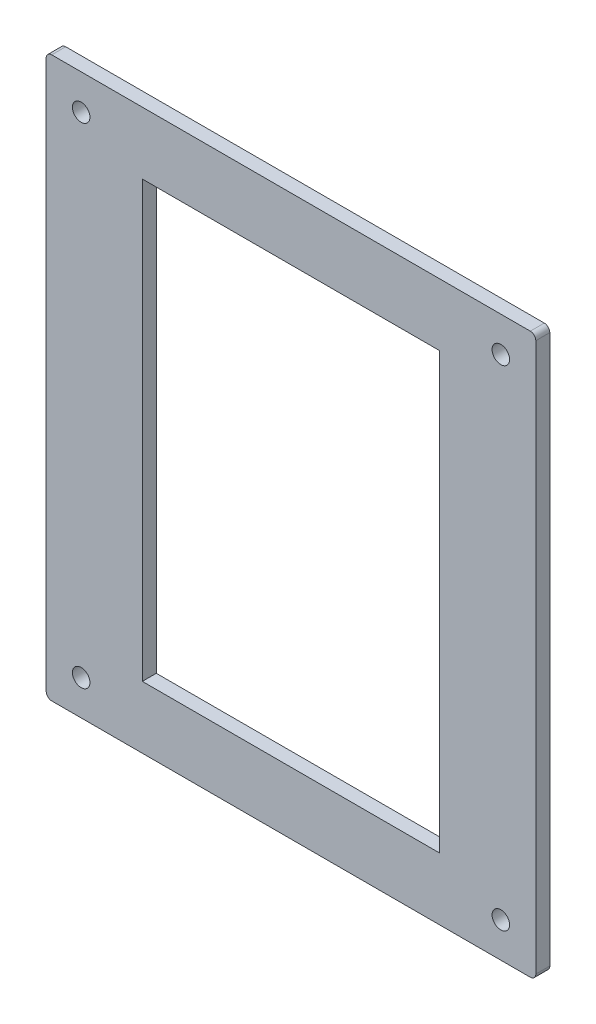
ISO-10303-21;
HEADER;
FILE_DESCRIPTION(('STEP AP214'),'2;1');
FILE_NAME('part.step','',(''),(''),'','','');
FILE_SCHEMA(('AUTOMOTIVE_DESIGN { 1 0 10303 214 1 1 1 1 }'));
ENDSEC;
DATA;
#1=APPLICATION_CONTEXT('core data for automotive mechanical design processes');
#2=APPLICATION_PROTOCOL_DEFINITION('international standard','automotive_design',2000,#1);
#3=PRODUCT_CONTEXT('',#1,'mechanical');
#4=PRODUCT('Part','Part','',(#3));
#5=PRODUCT_RELATED_PRODUCT_CATEGORY('part','',(#4));
#6=PRODUCT_DEFINITION_FORMATION('','',#4);
#7=PRODUCT_DEFINITION_CONTEXT('part definition',#1,'design');
#8=PRODUCT_DEFINITION('design','',#6,#7);
#9=PRODUCT_DEFINITION_SHAPE('','',#8);
#10=(LENGTH_UNIT() NAMED_UNIT(*) SI_UNIT(.MILLI.,.METRE.));
#11=(NAMED_UNIT(*) PLANE_ANGLE_UNIT() SI_UNIT($,.RADIAN.));
#12=(NAMED_UNIT(*) SI_UNIT($,.STERADIAN.) SOLID_ANGLE_UNIT());
#13=UNCERTAINTY_MEASURE_WITH_UNIT(LENGTH_MEASURE(1.E-05),#10,'distance_accuracy_value','');
#14=(GEOMETRIC_REPRESENTATION_CONTEXT(3) GLOBAL_UNCERTAINTY_ASSIGNED_CONTEXT((#13)) GLOBAL_UNIT_ASSIGNED_CONTEXT((#10,
#11,#12)) REPRESENTATION_CONTEXT('',''));
#15=CARTESIAN_POINT('',(0.,0.,0.));
#16=DIRECTION('',(0.,0.,1.));
#17=DIRECTION('',(1.,0.,0.));
#18=AXIS2_PLACEMENT_3D('',#15,#16,#17);
#19=CARTESIAN_POINT('',(0.,0.,2.54));
#20=DIRECTION('',(0.,0.,1.));
#21=DIRECTION('',(1.,0.,0.));
#22=AXIS2_PLACEMENT_3D('',#19,#20,#21);
#23=PLANE('',#22);
#24=CARTESIAN_POINT('',(82.55,-95.25,2.54));
#25=DIRECTION('',(0.,0.,1.));
#26=DIRECTION('',(1.,0.,0.));
#27=AXIS2_PLACEMENT_3D('',#24,#25,#26);
#28=CIRCLE('',#27,1.59);
#29=CARTESIAN_POINT('',(84.14,-95.25,2.54));
#30=VERTEX_POINT('',#29);
#31=EDGE_CURVE('E504',#30,#30,#28,.T.);
#32=ORIENTED_EDGE('',*,*,#31,.F.);
#33=EDGE_LOOP('',(#32));
#34=FACE_BOUND('',#33,.T.);
#35=CARTESIAN_POINT('',(6.35,-6.35,2.54));
#36=DIRECTION('',(0.,0.,1.));
#37=DIRECTION('',(1.,0.,0.));
#38=AXIS2_PLACEMENT_3D('',#35,#36,#37);
#39=CIRCLE('',#38,1.59);
#40=CARTESIAN_POINT('',(7.94,-6.35,2.54));
#41=VERTEX_POINT('',#40);
#42=EDGE_CURVE('E174',#41,#41,#39,.T.);
#43=ORIENTED_EDGE('',*,*,#42,.F.);
#44=EDGE_LOOP('',(#43));
#45=FACE_BOUND('',#44,.T.);
#46=DIRECTION('',(0.,-1.,0.));
#47=VECTOR('',#46,1.);
#48=CARTESIAN_POINT('',(0.,0.,2.54));
#49=LINE('',#48,#47);
#50=CARTESIAN_POINT('',(0.,-1.,2.54));
#51=VERTEX_POINT('',#50);
#52=CARTESIAN_POINT('',(0.,-100.6,2.54));
#53=VERTEX_POINT('',#52);
#54=EDGE_CURVE('E191',#51,#53,#49,.T.);
#55=ORIENTED_EDGE('',*,*,#54,.T.);
#56=CARTESIAN_POINT('',(1.,-100.6,2.54));
#57=DIRECTION('',(0.,0.,1.));
#58=DIRECTION('',(1.,0.,0.));
#59=AXIS2_PLACEMENT_3D('',#56,#57,#58);
#60=CIRCLE('',#59,1.);
#61=CARTESIAN_POINT('',(1.,-101.6,2.54));
#62=VERTEX_POINT('',#61);
#63=EDGE_CURVE('E253',#53,#62,#60,.T.);
#64=ORIENTED_EDGE('',*,*,#63,.T.);
#65=DIRECTION('',(1.,0.,0.));
#66=VECTOR('',#65,1.);
#67=CARTESIAN_POINT('',(0.,-101.6,2.54));
#68=LINE('',#67,#66);
#69=CARTESIAN_POINT('',(87.9,-101.6,2.54));
#70=VERTEX_POINT('',#69);
#71=EDGE_CURVE('E195',#62,#70,#68,.T.);
#72=ORIENTED_EDGE('',*,*,#71,.T.);
#73=CARTESIAN_POINT('',(87.9,-100.6,2.54));
#74=DIRECTION('',(0.,0.,1.));
#75=DIRECTION('',(1.,0.,0.));
#76=AXIS2_PLACEMENT_3D('',#73,#74,#75);
#77=CIRCLE('',#76,1.);
#78=CARTESIAN_POINT('',(88.9,-100.6,2.54));
#79=VERTEX_POINT('',#78);
#80=EDGE_CURVE('E250',#70,#79,#77,.T.);
#81=ORIENTED_EDGE('',*,*,#80,.T.);
#82=DIRECTION('',(0.,1.,0.));
#83=VECTOR('',#82,1.);
#84=CARTESIAN_POINT('',(88.9,0.,2.54));
#85=LINE('',#84,#83);
#86=CARTESIAN_POINT('',(88.9,-1.,2.54));
#87=VERTEX_POINT('',#86);
#88=EDGE_CURVE('E200',#79,#87,#85,.T.);
#89=ORIENTED_EDGE('',*,*,#88,.T.);
#90=CARTESIAN_POINT('',(87.9,-1.,2.54));
#91=DIRECTION('',(0.,0.,1.));
#92=DIRECTION('',(1.,0.,0.));
#93=AXIS2_PLACEMENT_3D('',#90,#91,#92);
#94=CIRCLE('',#93,1.);
#95=CARTESIAN_POINT('',(87.9,0.,2.54));
#96=VERTEX_POINT('',#95);
#97=EDGE_CURVE('E65',#87,#96,#94,.T.);
#98=ORIENTED_EDGE('',*,*,#97,.T.);
#99=DIRECTION('',(-1.,0.,0.));
#100=VECTOR('',#99,1.);
#101=CARTESIAN_POINT('',(0.,0.,2.54));
#102=LINE('',#101,#100);
#103=CARTESIAN_POINT('',(1.,0.,2.54));
#104=VERTEX_POINT('',#103);
#105=EDGE_CURVE('E203',#96,#104,#102,.T.);
#106=ORIENTED_EDGE('',*,*,#105,.T.);
#107=CARTESIAN_POINT('',(1.,-1.,2.54));
#108=DIRECTION('',(0.,0.,1.));
#109=DIRECTION('',(1.,0.,0.));
#110=AXIS2_PLACEMENT_3D('',#107,#108,#109);
#111=CIRCLE('',#110,1.);
#112=EDGE_CURVE('E245',#104,#51,#111,.T.);
#113=ORIENTED_EDGE('',*,*,#112,.T.);
#114=EDGE_LOOP('',(#55,#64,#72,#81,#89,#98,#106,#113));
#115=FACE_BOUND('',#114,.T.);
#116=DIRECTION('',(1.,0.,0.));
#117=VECTOR('',#116,1.);
#118=CARTESIAN_POINT('',(17.45,-90.3,2.54));
#119=LINE('',#118,#117);
#120=CARTESIAN_POINT('',(17.45,-90.3,2.54));
#121=VERTEX_POINT('',#120);
#122=CARTESIAN_POINT('',(71.45,-90.3,2.54));
#123=VERTEX_POINT('',#122);
#124=EDGE_CURVE('E146',#121,#123,#119,.T.);
#125=ORIENTED_EDGE('',*,*,#124,.F.);
#126=DIRECTION('',(0.,-1.,0.));
#127=VECTOR('',#126,1.);
#128=CARTESIAN_POINT('',(17.45,-11.3,2.54));
#129=LINE('',#128,#127);
#130=CARTESIAN_POINT('',(17.45,-11.3,2.54));
#131=VERTEX_POINT('',#130);
#132=EDGE_CURVE('E135',#131,#121,#129,.T.);
#133=ORIENTED_EDGE('',*,*,#132,.F.);
#134=DIRECTION('',(-1.,0.,0.));
#135=VECTOR('',#134,1.);
#136=CARTESIAN_POINT('',(17.45,-11.3,2.54));
#137=LINE('',#136,#135);
#138=CARTESIAN_POINT('',(71.45,-11.3,2.54));
#139=VERTEX_POINT('',#138);
#140=EDGE_CURVE('E165',#139,#131,#137,.T.);
#141=ORIENTED_EDGE('',*,*,#140,.F.);
#142=DIRECTION('',(0.,1.,0.));
#143=VECTOR('',#142,1.);
#144=CARTESIAN_POINT('',(71.45,-11.3,2.54));
#145=LINE('',#144,#143);
#146=EDGE_CURVE('E161',#123,#139,#145,.T.);
#147=ORIENTED_EDGE('',*,*,#146,.F.);
#148=EDGE_LOOP('',(#125,#133,#141,#147));
#149=FACE_BOUND('',#148,.T.);
#150=CARTESIAN_POINT('',(82.55,-6.35,2.54));
#151=DIRECTION('',(0.,0.,1.));
#152=DIRECTION('',(1.,0.,0.));
#153=AXIS2_PLACEMENT_3D('',#150,#151,#152);
#154=CIRCLE('',#153,1.58999999999999);
#155=CARTESIAN_POINT('',(84.14,-6.35,2.54));
#156=VERTEX_POINT('',#155);
#157=EDGE_CURVE('E512',#156,#156,#154,.T.);
#158=ORIENTED_EDGE('',*,*,#157,.F.);
#159=EDGE_LOOP('',(#158));
#160=FACE_BOUND('',#159,.T.);
#161=CARTESIAN_POINT('',(6.34999999999999,-95.25,2.54));
#162=DIRECTION('',(0.,0.,1.));
#163=DIRECTION('',(1.,0.,0.));
#164=AXIS2_PLACEMENT_3D('',#161,#162,#163);
#165=CIRCLE('',#164,1.59000000000001);
#166=CARTESIAN_POINT('',(7.94,-95.25,2.54));
#167=VERTEX_POINT('',#166);
#168=EDGE_CURVE('E493',#167,#167,#165,.T.);
#169=ORIENTED_EDGE('',*,*,#168,.F.);
#170=EDGE_LOOP('',(#169));
#171=FACE_BOUND('',#170,.T.);
#172=ADVANCED_FACE('F43',(#34,#45,#115,#149,#160,#171),#23,.T.);
#173=CARTESIAN_POINT('',(0.,0.,0.));
#174=DIRECTION('',(0.,0.,1.));
#175=DIRECTION('',(1.,0.,0.));
#176=AXIS2_PLACEMENT_3D('',#173,#174,#175);
#177=PLANE('',#176);
#178=DIRECTION('',(1.,0.,0.));
#179=VECTOR('',#178,1.);
#180=CARTESIAN_POINT('',(0.,-101.6,0.));
#181=LINE('',#180,#179);
#182=CARTESIAN_POINT('',(1.,-101.6,0.));
#183=VERTEX_POINT('',#182);
#184=CARTESIAN_POINT('',(87.9,-101.6,0.));
#185=VERTEX_POINT('',#184);
#186=EDGE_CURVE('E210',#183,#185,#181,.T.);
#187=ORIENTED_EDGE('',*,*,#186,.F.);
#188=CARTESIAN_POINT('',(1.,-100.6,0.));
#189=DIRECTION('',(0.,0.,1.));
#190=DIRECTION('',(1.,0.,0.));
#191=AXIS2_PLACEMENT_3D('',#188,#189,#190);
#192=CIRCLE('',#191,1.);
#193=CARTESIAN_POINT('',(0.,-100.6,0.));
#194=VERTEX_POINT('',#193);
#195=EDGE_CURVE('E235',#183,#194,#192,.F.);
#196=ORIENTED_EDGE('',*,*,#195,.T.);
#197=DIRECTION('',(0.,-1.,0.));
#198=VECTOR('',#197,1.);
#199=CARTESIAN_POINT('',(0.,0.,0.));
#200=LINE('',#199,#198);
#201=CARTESIAN_POINT('',(0.,-1.,0.));
#202=VERTEX_POINT('',#201);
#203=EDGE_CURVE('E155',#202,#194,#200,.T.);
#204=ORIENTED_EDGE('',*,*,#203,.F.);
#205=CARTESIAN_POINT('',(1.,-1.,0.));
#206=DIRECTION('',(0.,0.,1.));
#207=DIRECTION('',(1.,0.,0.));
#208=AXIS2_PLACEMENT_3D('',#205,#206,#207);
#209=CIRCLE('',#208,1.);
#210=CARTESIAN_POINT('',(1.,0.,0.));
#211=VERTEX_POINT('',#210);
#212=EDGE_CURVE('E226',#202,#211,#209,.F.);
#213=ORIENTED_EDGE('',*,*,#212,.T.);
#214=DIRECTION('',(-1.,0.,0.));
#215=VECTOR('',#214,1.);
#216=CARTESIAN_POINT('',(0.,0.,0.));
#217=LINE('',#216,#215);
#218=CARTESIAN_POINT('',(87.9,0.,0.));
#219=VERTEX_POINT('',#218);
#220=EDGE_CURVE('E196',#219,#211,#217,.T.);
#221=ORIENTED_EDGE('',*,*,#220,.F.);
#222=CARTESIAN_POINT('',(87.9,-1.,0.));
#223=DIRECTION('',(0.,0.,1.));
#224=DIRECTION('',(1.,0.,0.));
#225=AXIS2_PLACEMENT_3D('',#222,#223,#224);
#226=CIRCLE('',#225,1.);
#227=CARTESIAN_POINT('',(88.9,-1.,0.));
#228=VERTEX_POINT('',#227);
#229=EDGE_CURVE('E229',#219,#228,#226,.F.);
#230=ORIENTED_EDGE('',*,*,#229,.T.);
#231=DIRECTION('',(0.,1.,0.));
#232=VECTOR('',#231,1.);
#233=CARTESIAN_POINT('',(88.9,0.,0.));
#234=LINE('',#233,#232);
#235=CARTESIAN_POINT('',(88.9,-100.6,0.));
#236=VERTEX_POINT('',#235);
#237=EDGE_CURVE('E214',#236,#228,#234,.T.);
#238=ORIENTED_EDGE('',*,*,#237,.F.);
#239=CARTESIAN_POINT('',(87.9,-100.6,0.));
#240=DIRECTION('',(0.,0.,1.));
#241=DIRECTION('',(1.,0.,0.));
#242=AXIS2_PLACEMENT_3D('',#239,#240,#241);
#243=CIRCLE('',#242,1.);
#244=EDGE_CURVE('E232',#236,#185,#243,.F.);
#245=ORIENTED_EDGE('',*,*,#244,.T.);
#246=EDGE_LOOP('',(#187,#196,#204,#213,#221,#230,#238,#245));
#247=FACE_BOUND('',#246,.T.);
#248=DIRECTION('',(0.,-1.,0.));
#249=VECTOR('',#248,1.);
#250=CARTESIAN_POINT('',(17.45,-11.3,0.));
#251=LINE('',#250,#249);
#252=CARTESIAN_POINT('',(17.45,-11.3,0.));
#253=VERTEX_POINT('',#252);
#254=CARTESIAN_POINT('',(17.45,-90.3,0.));
#255=VERTEX_POINT('',#254);
#256=EDGE_CURVE('E171',#253,#255,#251,.T.);
#257=ORIENTED_EDGE('',*,*,#256,.T.);
#258=DIRECTION('',(1.,0.,0.));
#259=VECTOR('',#258,1.);
#260=CARTESIAN_POINT('',(17.45,-90.3,0.));
#261=LINE('',#260,#259);
#262=CARTESIAN_POINT('',(71.45,-90.3,0.));
#263=VERTEX_POINT('',#262);
#264=EDGE_CURVE('E153',#255,#263,#261,.T.);
#265=ORIENTED_EDGE('',*,*,#264,.T.);
#266=DIRECTION('',(0.,1.,0.));
#267=VECTOR('',#266,1.);
#268=CARTESIAN_POINT('',(71.45,-11.3,0.));
#269=LINE('',#268,#267);
#270=CARTESIAN_POINT('',(71.45,-11.3,0.));
#271=VERTEX_POINT('',#270);
#272=EDGE_CURVE('E177',#263,#271,#269,.T.);
#273=ORIENTED_EDGE('',*,*,#272,.T.);
#274=DIRECTION('',(-1.,0.,0.));
#275=VECTOR('',#274,1.);
#276=CARTESIAN_POINT('',(17.45,-11.3,0.));
#277=LINE('',#276,#275);
#278=EDGE_CURVE('E147',#271,#253,#277,.T.);
#279=ORIENTED_EDGE('',*,*,#278,.T.);
#280=EDGE_LOOP('',(#257,#265,#273,#279));
#281=FACE_BOUND('',#280,.T.);
#282=CARTESIAN_POINT('',(6.35,-6.35,0.));
#283=DIRECTION('',(0.,0.,1.));
#284=DIRECTION('',(1.,0.,0.));
#285=AXIS2_PLACEMENT_3D('',#282,#283,#284);
#286=CIRCLE('',#285,1.59);
#287=CARTESIAN_POINT('',(7.94,-6.35,0.));
#288=VERTEX_POINT('',#287);
#289=EDGE_CURVE('E516',#288,#288,#286,.T.);
#290=ORIENTED_EDGE('',*,*,#289,.T.);
#291=EDGE_LOOP('',(#290));
#292=FACE_BOUND('',#291,.T.);
#293=CARTESIAN_POINT('',(82.55,-6.35,0.));
#294=DIRECTION('',(0.,0.,1.));
#295=DIRECTION('',(1.,0.,0.));
#296=AXIS2_PLACEMENT_3D('',#293,#294,#295);
#297=CIRCLE('',#296,1.58999999999999);
#298=CARTESIAN_POINT('',(84.14,-6.35,0.));
#299=VERTEX_POINT('',#298);
#300=EDGE_CURVE('E508',#299,#299,#297,.T.);
#301=ORIENTED_EDGE('',*,*,#300,.T.);
#302=EDGE_LOOP('',(#301));
#303=FACE_BOUND('',#302,.T.);
#304=CARTESIAN_POINT('',(82.55,-95.25,0.));
#305=DIRECTION('',(0.,0.,1.));
#306=DIRECTION('',(1.,0.,0.));
#307=AXIS2_PLACEMENT_3D('',#304,#305,#306);
#308=CIRCLE('',#307,1.59);
#309=CARTESIAN_POINT('',(84.14,-95.25,0.));
#310=VERTEX_POINT('',#309);
#311=EDGE_CURVE('E501',#310,#310,#308,.T.);
#312=ORIENTED_EDGE('',*,*,#311,.T.);
#313=EDGE_LOOP('',(#312));
#314=FACE_BOUND('',#313,.T.);
#315=CARTESIAN_POINT('',(6.34999999999999,-95.25,0.));
#316=DIRECTION('',(0.,0.,1.));
#317=DIRECTION('',(1.,0.,0.));
#318=AXIS2_PLACEMENT_3D('',#315,#316,#317);
#319=CIRCLE('',#318,1.59000000000001);
#320=CARTESIAN_POINT('',(7.94,-95.25,0.));
#321=VERTEX_POINT('',#320);
#322=EDGE_CURVE('E496',#321,#321,#319,.T.);
#323=ORIENTED_EDGE('',*,*,#322,.T.);
#324=EDGE_LOOP('',(#323));
#325=FACE_BOUND('',#324,.T.);
#326=ADVANCED_FACE('F273',(#247,#281,#292,#303,#314,#325),#177,.F.);
#327=CARTESIAN_POINT('',(0.,0.,2.54));
#328=DIRECTION('',(1.,0.,0.));
#329=DIRECTION('',(0.,0.,-1.));
#330=AXIS2_PLACEMENT_3D('',#327,#328,#329);
#331=PLANE('',#330);
#332=ORIENTED_EDGE('',*,*,#203,.T.);
#333=DIRECTION('',(0.,0.,-1.));
#334=VECTOR('',#333,1.);
#335=CARTESIAN_POINT('',(0.,-100.6,2.54));
#336=LINE('',#335,#334);
#337=EDGE_CURVE('E242',#194,#53,#336,.F.);
#338=ORIENTED_EDGE('',*,*,#337,.T.);
#339=ORIENTED_EDGE('',*,*,#54,.F.);
#340=DIRECTION('',(0.,0.,-1.));
#341=VECTOR('',#340,1.);
#342=CARTESIAN_POINT('',(0.,-1.,2.54));
#343=LINE('',#342,#341);
#344=EDGE_CURVE('E238',#51,#202,#343,.T.);
#345=ORIENTED_EDGE('',*,*,#344,.T.);
#346=EDGE_LOOP('',(#332,#338,#339,#345));
#347=FACE_BOUND('',#346,.T.);
#348=ADVANCED_FACE('F286',(#347),#331,.F.);
#349=CARTESIAN_POINT('',(0.,-101.6,2.54));
#350=DIRECTION('',(0.,1.,0.));
#351=DIRECTION('',(0.,0.,1.));
#352=AXIS2_PLACEMENT_3D('',#349,#350,#351);
#353=PLANE('',#352);
#354=ORIENTED_EDGE('',*,*,#71,.F.);
#355=DIRECTION('',(0.,0.,-1.));
#356=VECTOR('',#355,1.);
#357=CARTESIAN_POINT('',(1.,-101.6,2.54));
#358=LINE('',#357,#356);
#359=EDGE_CURVE('E222',#62,#183,#358,.T.);
#360=ORIENTED_EDGE('',*,*,#359,.T.);
#361=ORIENTED_EDGE('',*,*,#186,.T.);
#362=DIRECTION('',(0.,0.,-1.));
#363=VECTOR('',#362,1.);
#364=CARTESIAN_POINT('',(87.9,-101.6,2.54));
#365=LINE('',#364,#363);
#366=EDGE_CURVE('E206',#185,#70,#365,.F.);
#367=ORIENTED_EDGE('',*,*,#366,.T.);
#368=EDGE_LOOP('',(#354,#360,#361,#367));
#369=FACE_BOUND('',#368,.T.);
#370=ADVANCED_FACE('F294',(#369),#353,.F.);
#371=CARTESIAN_POINT('',(88.9,0.,2.54));
#372=DIRECTION('',(-1.,0.,0.));
#373=DIRECTION('',(0.,0.,1.));
#374=AXIS2_PLACEMENT_3D('',#371,#372,#373);
#375=PLANE('',#374);
#376=ORIENTED_EDGE('',*,*,#88,.F.);
#377=DIRECTION('',(0.,0.,-1.));
#378=VECTOR('',#377,1.);
#379=CARTESIAN_POINT('',(88.9,-100.6,2.54));
#380=LINE('',#379,#378);
#381=EDGE_CURVE('E259',#79,#236,#380,.T.);
#382=ORIENTED_EDGE('',*,*,#381,.T.);
#383=ORIENTED_EDGE('',*,*,#237,.T.);
#384=DIRECTION('',(0.,0.,-1.));
#385=VECTOR('',#384,1.);
#386=CARTESIAN_POINT('',(88.9,-1.,2.54));
#387=LINE('',#386,#385);
#388=EDGE_CURVE('E256',#228,#87,#387,.F.);
#389=ORIENTED_EDGE('',*,*,#388,.T.);
#390=EDGE_LOOP('',(#376,#382,#383,#389));
#391=FACE_BOUND('',#390,.T.);
#392=ADVANCED_FACE('F267',(#391),#375,.F.);
#393=CARTESIAN_POINT('',(0.,0.,2.54));
#394=DIRECTION('',(0.,-1.,0.));
#395=DIRECTION('',(0.,0.,-1.));
#396=AXIS2_PLACEMENT_3D('',#393,#394,#395);
#397=PLANE('',#396);
#398=ORIENTED_EDGE('',*,*,#105,.F.);
#399=DIRECTION('',(0.,0.,-1.));
#400=VECTOR('',#399,1.);
#401=CARTESIAN_POINT('',(87.9,0.,2.54));
#402=LINE('',#401,#400);
#403=EDGE_CURVE('E11',#96,#219,#402,.T.);
#404=ORIENTED_EDGE('',*,*,#403,.T.);
#405=ORIENTED_EDGE('',*,*,#220,.T.);
#406=DIRECTION('',(0.,0.,-1.));
#407=VECTOR('',#406,1.);
#408=CARTESIAN_POINT('',(1.,0.,2.54));
#409=LINE('',#408,#407);
#410=EDGE_CURVE('E52',#211,#104,#409,.F.);
#411=ORIENTED_EDGE('',*,*,#410,.T.);
#412=EDGE_LOOP('',(#398,#404,#405,#411));
#413=FACE_BOUND('',#412,.T.);
#414=ADVANCED_FACE('F279',(#413),#397,.F.);
#415=CARTESIAN_POINT('',(17.45,-11.3,2.54));
#416=DIRECTION('',(1.,0.,0.));
#417=DIRECTION('',(0.,0.,-1.));
#418=AXIS2_PLACEMENT_3D('',#415,#416,#417);
#419=PLANE('',#418);
#420=ORIENTED_EDGE('',*,*,#256,.F.);
#421=DIRECTION('',(0.,0.,-1.));
#422=VECTOR('',#421,1.);
#423=CARTESIAN_POINT('',(17.45,-11.3,2.54));
#424=LINE('',#423,#422);
#425=EDGE_CURVE('E141',#131,#253,#424,.T.);
#426=ORIENTED_EDGE('',*,*,#425,.F.);
#427=ORIENTED_EDGE('',*,*,#132,.T.);
#428=DIRECTION('',(0.,0.,-1.));
#429=VECTOR('',#428,1.);
#430=CARTESIAN_POINT('',(17.45,-90.3,2.54));
#431=LINE('',#430,#429);
#432=EDGE_CURVE('E138',#121,#255,#431,.T.);
#433=ORIENTED_EDGE('',*,*,#432,.T.);
#434=EDGE_LOOP('',(#420,#426,#427,#433));
#435=FACE_BOUND('',#434,.T.);
#436=ADVANCED_FACE('F137',(#435),#419,.T.);
#437=CARTESIAN_POINT('',(17.45,-90.3,2.54));
#438=DIRECTION('',(0.,1.,0.));
#439=DIRECTION('',(0.,0.,1.));
#440=AXIS2_PLACEMENT_3D('',#437,#438,#439);
#441=PLANE('',#440);
#442=ORIENTED_EDGE('',*,*,#264,.F.);
#443=ORIENTED_EDGE('',*,*,#432,.F.);
#444=ORIENTED_EDGE('',*,*,#124,.T.);
#445=DIRECTION('',(0.,0.,-1.));
#446=VECTOR('',#445,1.);
#447=CARTESIAN_POINT('',(71.45,-90.3,2.54));
#448=LINE('',#447,#446);
#449=EDGE_CURVE('E156',#123,#263,#448,.T.);
#450=ORIENTED_EDGE('',*,*,#449,.T.);
#451=EDGE_LOOP('',(#442,#443,#444,#450));
#452=FACE_BOUND('',#451,.T.);
#453=ADVANCED_FACE('F150',(#452),#441,.T.);
#454=CARTESIAN_POINT('',(71.45,-11.3,2.54));
#455=DIRECTION('',(-1.,0.,0.));
#456=DIRECTION('',(0.,0.,1.));
#457=AXIS2_PLACEMENT_3D('',#454,#455,#456);
#458=PLANE('',#457);
#459=ORIENTED_EDGE('',*,*,#272,.F.);
#460=ORIENTED_EDGE('',*,*,#449,.F.);
#461=ORIENTED_EDGE('',*,*,#146,.T.);
#462=DIRECTION('',(0.,0.,-1.));
#463=VECTOR('',#462,1.);
#464=CARTESIAN_POINT('',(71.45,-11.3,2.54));
#465=LINE('',#464,#463);
#466=EDGE_CURVE('E186',#139,#271,#465,.T.);
#467=ORIENTED_EDGE('',*,*,#466,.T.);
#468=EDGE_LOOP('',(#459,#460,#461,#467));
#469=FACE_BOUND('',#468,.T.);
#470=ADVANCED_FACE('F352',(#469),#458,.T.);
#471=CARTESIAN_POINT('',(17.45,-11.3,2.54));
#472=DIRECTION('',(0.,-1.,0.));
#473=DIRECTION('',(0.,0.,-1.));
#474=AXIS2_PLACEMENT_3D('',#471,#472,#473);
#475=PLANE('',#474);
#476=ORIENTED_EDGE('',*,*,#278,.F.);
#477=ORIENTED_EDGE('',*,*,#466,.F.);
#478=ORIENTED_EDGE('',*,*,#140,.T.);
#479=ORIENTED_EDGE('',*,*,#425,.T.);
#480=EDGE_LOOP('',(#476,#477,#478,#479));
#481=FACE_BOUND('',#480,.T.);
#482=ADVANCED_FACE('F358',(#481),#475,.T.);
#483=CARTESIAN_POINT('',(6.35,-6.35,2.54));
#484=DIRECTION('',(0.,0.,-1.));
#485=DIRECTION('',(-1.,0.,0.));
#486=AXIS2_PLACEMENT_3D('',#483,#484,#485);
#487=CYLINDRICAL_SURFACE('',#486,1.59);
#488=ORIENTED_EDGE('',*,*,#42,.T.);
#489=EDGE_LOOP('',(#488));
#490=FACE_BOUND('',#489,.T.);
#491=ORIENTED_EDGE('',*,*,#289,.F.);
#492=EDGE_LOOP('',(#491));
#493=FACE_BOUND('',#492,.T.);
#494=ADVANCED_FACE('F366',(#490,#493),#487,.F.);
#495=CARTESIAN_POINT('',(82.55,-6.35,2.54));
#496=DIRECTION('',(0.,0.,-1.));
#497=DIRECTION('',(-1.,0.,0.));
#498=AXIS2_PLACEMENT_3D('',#495,#496,#497);
#499=CYLINDRICAL_SURFACE('',#498,1.58999999999999);
#500=ORIENTED_EDGE('',*,*,#157,.T.);
#501=EDGE_LOOP('',(#500));
#502=FACE_BOUND('',#501,.T.);
#503=ORIENTED_EDGE('',*,*,#300,.F.);
#504=EDGE_LOOP('',(#503));
#505=FACE_BOUND('',#504,.T.);
#506=ADVANCED_FACE('F374',(#502,#505),#499,.F.);
#507=CARTESIAN_POINT('',(82.55,-95.25,2.54));
#508=DIRECTION('',(0.,0.,-1.));
#509=DIRECTION('',(-1.,0.,0.));
#510=AXIS2_PLACEMENT_3D('',#507,#508,#509);
#511=CYLINDRICAL_SURFACE('',#510,1.59);
#512=ORIENTED_EDGE('',*,*,#31,.T.);
#513=EDGE_LOOP('',(#512));
#514=FACE_BOUND('',#513,.T.);
#515=ORIENTED_EDGE('',*,*,#311,.F.);
#516=EDGE_LOOP('',(#515));
#517=FACE_BOUND('',#516,.T.);
#518=ADVANCED_FACE('F382',(#514,#517),#511,.F.);
#519=CARTESIAN_POINT('',(6.34999999999999,-95.25,2.54));
#520=DIRECTION('',(0.,0.,-1.));
#521=DIRECTION('',(-1.,0.,0.));
#522=AXIS2_PLACEMENT_3D('',#519,#520,#521);
#523=CYLINDRICAL_SURFACE('',#522,1.59000000000001);
#524=ORIENTED_EDGE('',*,*,#168,.T.);
#525=EDGE_LOOP('',(#524));
#526=FACE_BOUND('',#525,.T.);
#527=ORIENTED_EDGE('',*,*,#322,.F.);
#528=EDGE_LOOP('',(#527));
#529=FACE_BOUND('',#528,.T.);
#530=ADVANCED_FACE('F303',(#526,#529),#523,.F.);
#531=CARTESIAN_POINT('',(1.,-100.6,2.54));
#532=DIRECTION('',(0.,0.,-1.));
#533=DIRECTION('',(-1.,0.,0.));
#534=AXIS2_PLACEMENT_3D('',#531,#532,#533);
#535=CYLINDRICAL_SURFACE('',#534,1.);
#536=ORIENTED_EDGE('',*,*,#63,.F.);
#537=ORIENTED_EDGE('',*,*,#337,.F.);
#538=ORIENTED_EDGE('',*,*,#195,.F.);
#539=ORIENTED_EDGE('',*,*,#359,.F.);
#540=EDGE_LOOP('',(#536,#537,#538,#539));
#541=FACE_BOUND('',#540,.T.);
#542=ADVANCED_FACE('F291',(#541),#535,.T.);
#543=CARTESIAN_POINT('',(87.9,-100.6,2.54));
#544=DIRECTION('',(0.,0.,-1.));
#545=DIRECTION('',(-1.,0.,0.));
#546=AXIS2_PLACEMENT_3D('',#543,#544,#545);
#547=CYLINDRICAL_SURFACE('',#546,1.);
#548=ORIENTED_EDGE('',*,*,#80,.F.);
#549=ORIENTED_EDGE('',*,*,#366,.F.);
#550=ORIENTED_EDGE('',*,*,#244,.F.);
#551=ORIENTED_EDGE('',*,*,#381,.F.);
#552=EDGE_LOOP('',(#548,#549,#550,#551));
#553=FACE_BOUND('',#552,.T.);
#554=ADVANCED_FACE('F296',(#553),#547,.T.);
#555=CARTESIAN_POINT('',(87.9,-1.,2.54));
#556=DIRECTION('',(0.,0.,-1.));
#557=DIRECTION('',(-1.,0.,0.));
#558=AXIS2_PLACEMENT_3D('',#555,#556,#557);
#559=CYLINDRICAL_SURFACE('',#558,1.);
#560=ORIENTED_EDGE('',*,*,#97,.F.);
#561=ORIENTED_EDGE('',*,*,#388,.F.);
#562=ORIENTED_EDGE('',*,*,#229,.F.);
#563=ORIENTED_EDGE('',*,*,#403,.F.);
#564=EDGE_LOOP('',(#560,#561,#562,#563));
#565=FACE_BOUND('',#564,.T.);
#566=ADVANCED_FACE('F278',(#565),#559,.T.);
#567=CARTESIAN_POINT('',(1.,-1.,2.54));
#568=DIRECTION('',(0.,0.,-1.));
#569=DIRECTION('',(-1.,0.,0.));
#570=AXIS2_PLACEMENT_3D('',#567,#568,#569);
#571=CYLINDRICAL_SURFACE('',#570,1.);
#572=ORIENTED_EDGE('',*,*,#112,.F.);
#573=ORIENTED_EDGE('',*,*,#410,.F.);
#574=ORIENTED_EDGE('',*,*,#212,.F.);
#575=ORIENTED_EDGE('',*,*,#344,.F.);
#576=EDGE_LOOP('',(#572,#573,#574,#575));
#577=FACE_BOUND('',#576,.T.);
#578=ADVANCED_FACE('F45',(#577),#571,.T.);
#579=CLOSED_SHELL('',(#172,#326,#348,#370,#392,#414,#436,#453,#470,#482,#494,#506,#518,#530,
#542,#554,#566,#578));
#580=MANIFOLD_SOLID_BREP('B2',#579);
#581=ADVANCED_BREP_SHAPE_REPRESENTATION('',(#18,#580),#14);
#582=SHAPE_DEFINITION_REPRESENTATION(#9,#581);
ENDSEC;
END-ISO-10303-21;
